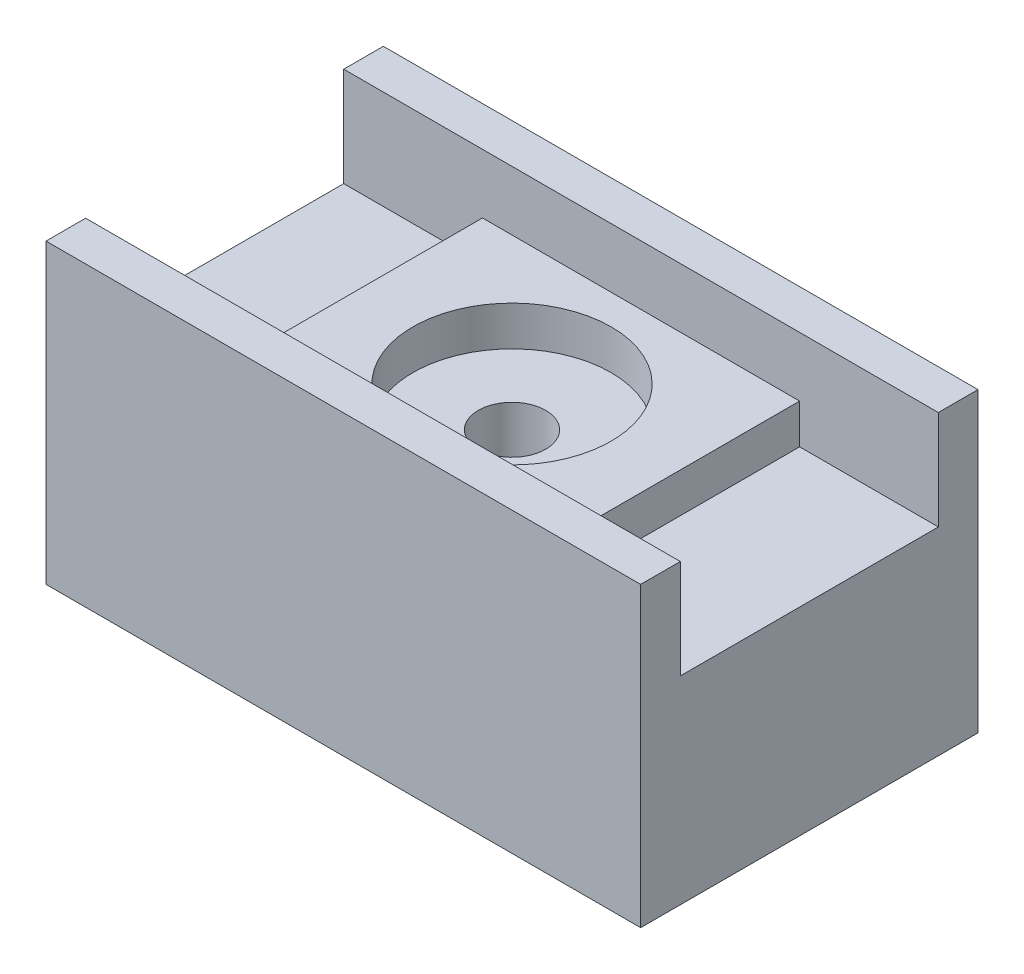
ISO-10303-21;
HEADER;
FILE_DESCRIPTION(('STEP AP214'),'2;1');
FILE_NAME('part.step','',(''),(''),'','','');
FILE_SCHEMA(('AUTOMOTIVE_DESIGN { 1 0 10303 214 1 1 1 1 }'));
ENDSEC;
DATA;
#1=APPLICATION_CONTEXT('core data for automotive mechanical design processes');
#2=APPLICATION_PROTOCOL_DEFINITION('international standard','automotive_design',2000,#1);
#3=PRODUCT_CONTEXT('',#1,'mechanical');
#4=PRODUCT('Part','Part','',(#3));
#5=PRODUCT_RELATED_PRODUCT_CATEGORY('part','',(#4));
#6=PRODUCT_DEFINITION_FORMATION('','',#4);
#7=PRODUCT_DEFINITION_CONTEXT('part definition',#1,'design');
#8=PRODUCT_DEFINITION('design','',#6,#7);
#9=PRODUCT_DEFINITION_SHAPE('','',#8);
#10=(LENGTH_UNIT() NAMED_UNIT(*) SI_UNIT(.MILLI.,.METRE.));
#11=(NAMED_UNIT(*) PLANE_ANGLE_UNIT() SI_UNIT($,.RADIAN.));
#12=(NAMED_UNIT(*) SI_UNIT($,.STERADIAN.) SOLID_ANGLE_UNIT());
#13=UNCERTAINTY_MEASURE_WITH_UNIT(LENGTH_MEASURE(1.E-05),#10,'distance_accuracy_value','');
#14=(GEOMETRIC_REPRESENTATION_CONTEXT(3) GLOBAL_UNCERTAINTY_ASSIGNED_CONTEXT((#13)) GLOBAL_UNIT_ASSIGNED_CONTEXT((#10,
#11,#12)) REPRESENTATION_CONTEXT('',''));
#15=CARTESIAN_POINT('',(0.,0.,0.));
#16=DIRECTION('',(0.,0.,1.));
#17=DIRECTION('',(1.,0.,0.));
#18=AXIS2_PLACEMENT_3D('',#15,#16,#17);
#19=CARTESIAN_POINT('',(0.,-10.,0.));
#20=DIRECTION('',(0.,1.,0.));
#21=DIRECTION('',(0.,0.,1.));
#22=AXIS2_PLACEMENT_3D('',#19,#20,#21);
#23=CYLINDRICAL_SURFACE('',#22,1.7);
#24=CARTESIAN_POINT('',(0.,-10.,0.));
#25=DIRECTION('',(0.,1.,0.));
#26=DIRECTION('',(0.,0.,1.));
#27=AXIS2_PLACEMENT_3D('',#24,#25,#26);
#28=CIRCLE('',#27,1.7);
#29=CARTESIAN_POINT('',(0.,-10.,1.7));
#30=VERTEX_POINT('',#29);
#31=EDGE_CURVE('E158',#30,#30,#28,.T.);
#32=ORIENTED_EDGE('',*,*,#31,.F.);
#33=EDGE_LOOP('',(#32));
#34=FACE_BOUND('',#33,.T.);
#35=CARTESIAN_POINT('',(0.,0.,0.));
#36=DIRECTION('',(0.,1.,0.));
#37=DIRECTION('',(0.,0.,1.));
#38=AXIS2_PLACEMENT_3D('',#35,#36,#37);
#39=CIRCLE('',#38,1.7);
#40=CARTESIAN_POINT('',(0.,0.,1.7));
#41=VERTEX_POINT('',#40);
#42=EDGE_CURVE('E231',#41,#41,#39,.F.);
#43=ORIENTED_EDGE('',*,*,#42,.F.);
#44=EDGE_LOOP('',(#43));
#45=FACE_BOUND('',#44,.T.);
#46=ADVANCED_FACE('F37',(#34,#45),#23,.F.);
#47=CARTESIAN_POINT('',(0.,0.,0.));
#48=DIRECTION('',(0.,1.,0.));
#49=DIRECTION('',(0.,0.,1.));
#50=AXIS2_PLACEMENT_3D('',#47,#48,#49);
#51=PLANE('',#50);
#52=DIRECTION('',(-1.,0.,0.));
#53=VECTOR('',#52,1.);
#54=CARTESIAN_POINT('',(0.,0.,-6.51));
#55=LINE('',#54,#53);
#56=CARTESIAN_POINT('',(-8.,0.,-6.51));
#57=VERTEX_POINT('',#56);
#58=CARTESIAN_POINT('',(-15.,0.,-6.51));
#59=VERTEX_POINT('',#58);
#60=EDGE_CURVE('E54',#57,#59,#55,.T.);
#61=ORIENTED_EDGE('',*,*,#60,.T.);
#62=DIRECTION('',(0.,0.,-1.));
#63=VECTOR('',#62,1.);
#64=CARTESIAN_POINT('',(-15.,0.,0.));
#65=LINE('',#64,#63);
#66=CARTESIAN_POINT('',(-15.,0.,6.51));
#67=VERTEX_POINT('',#66);
#68=EDGE_CURVE('E213',#67,#59,#65,.T.);
#69=ORIENTED_EDGE('',*,*,#68,.F.);
#70=DIRECTION('',(1.,0.,0.));
#71=VECTOR('',#70,1.);
#72=CARTESIAN_POINT('',(0.,0.,6.51));
#73=LINE('',#72,#71);
#74=CARTESIAN_POINT('',(-8.,0.,6.51));
#75=VERTEX_POINT('',#74);
#76=EDGE_CURVE('E168',#67,#75,#73,.T.);
#77=ORIENTED_EDGE('',*,*,#76,.T.);
#78=DIRECTION('',(0.,0.,1.));
#79=VECTOR('',#78,1.);
#80=CARTESIAN_POINT('',(-8.,0.,0.));
#81=LINE('',#80,#79);
#82=EDGE_CURVE('E182',#57,#75,#81,.T.);
#83=ORIENTED_EDGE('',*,*,#82,.F.);
#84=EDGE_LOOP('',(#61,#69,#77,#83));
#85=FACE_BOUND('',#84,.T.);
#86=ADVANCED_FACE('F259',(#85),#51,.T.);
#87=CARTESIAN_POINT('',(15.,-10.,0.));
#88=DIRECTION('',(1.,0.,0.));
#89=DIRECTION('',(0.,0.,-1.));
#90=AXIS2_PLACEMENT_3D('',#87,#88,#89);
#91=PLANE('',#90);
#92=DIRECTION('',(0.,0.,-1.));
#93=VECTOR('',#92,1.);
#94=CARTESIAN_POINT('',(15.,0.,0.));
#95=LINE('',#94,#93);
#96=CARTESIAN_POINT('',(15.,0.,6.51));
#97=VERTEX_POINT('',#96);
#98=CARTESIAN_POINT('',(15.,0.,-6.51));
#99=VERTEX_POINT('',#98);
#100=EDGE_CURVE('E62',#97,#99,#95,.T.);
#101=ORIENTED_EDGE('',*,*,#100,.F.);
#102=DIRECTION('',(0.,-1.,0.));
#103=VECTOR('',#102,1.);
#104=CARTESIAN_POINT('',(15.,5.,6.51));
#105=LINE('',#104,#103);
#106=CARTESIAN_POINT('',(15.,5.,6.51));
#107=VERTEX_POINT('',#106);
#108=EDGE_CURVE('E176',#107,#97,#105,.T.);
#109=ORIENTED_EDGE('',*,*,#108,.F.);
#110=DIRECTION('',(0.,0.,-1.));
#111=VECTOR('',#110,1.);
#112=CARTESIAN_POINT('',(15.,5.,0.));
#113=LINE('',#112,#111);
#114=CARTESIAN_POINT('',(15.,5.,8.51));
#115=VERTEX_POINT('',#114);
#116=EDGE_CURVE('E174',#115,#107,#113,.T.);
#117=ORIENTED_EDGE('',*,*,#116,.F.);
#118=DIRECTION('',(0.,1.,0.));
#119=VECTOR('',#118,1.);
#120=CARTESIAN_POINT('',(15.,-10.,8.51));
#121=LINE('',#120,#119);
#122=CARTESIAN_POINT('',(15.,-10.,8.51));
#123=VERTEX_POINT('',#122);
#124=EDGE_CURVE('E12',#123,#115,#121,.T.);
#125=ORIENTED_EDGE('',*,*,#124,.F.);
#126=DIRECTION('',(0.,0.,-1.));
#127=VECTOR('',#126,1.);
#128=CARTESIAN_POINT('',(15.,-10.,0.));
#129=LINE('',#128,#127);
#130=CARTESIAN_POINT('',(15.,-10.,-8.51));
#131=VERTEX_POINT('',#130);
#132=EDGE_CURVE('E210',#123,#131,#129,.T.);
#133=ORIENTED_EDGE('',*,*,#132,.T.);
#134=DIRECTION('',(0.,1.,0.));
#135=VECTOR('',#134,1.);
#136=CARTESIAN_POINT('',(15.,-10.,-8.51));
#137=LINE('',#136,#135);
#138=CARTESIAN_POINT('',(15.,5.,-8.51));
#139=VERTEX_POINT('',#138);
#140=EDGE_CURVE('E41',#131,#139,#137,.T.);
#141=ORIENTED_EDGE('',*,*,#140,.T.);
#142=DIRECTION('',(0.,0.,-1.));
#143=VECTOR('',#142,1.);
#144=CARTESIAN_POINT('',(15.,5.,0.));
#145=LINE('',#144,#143);
#146=CARTESIAN_POINT('',(15.,5.,-6.51));
#147=VERTEX_POINT('',#146);
#148=EDGE_CURVE('E144',#147,#139,#145,.T.);
#149=ORIENTED_EDGE('',*,*,#148,.F.);
#150=DIRECTION('',(0.,-1.,0.));
#151=VECTOR('',#150,1.);
#152=CARTESIAN_POINT('',(15.,5.,-6.51));
#153=LINE('',#152,#151);
#154=EDGE_CURVE('E129',#147,#99,#153,.T.);
#155=ORIENTED_EDGE('',*,*,#154,.T.);
#156=EDGE_LOOP('',(#101,#109,#117,#125,#133,#141,#149,#155));
#157=FACE_BOUND('',#156,.T.);
#158=ADVANCED_FACE('F39',(#157),#91,.T.);
#159=CARTESIAN_POINT('',(0.,-10.,8.51));
#160=DIRECTION('',(0.,0.,1.));
#161=DIRECTION('',(1.,0.,0.));
#162=AXIS2_PLACEMENT_3D('',#159,#160,#161);
#163=PLANE('',#162);
#164=ORIENTED_EDGE('',*,*,#124,.T.);
#165=DIRECTION('',(1.,0.,0.));
#166=VECTOR('',#165,1.);
#167=CARTESIAN_POINT('',(0.,5.,8.51));
#168=LINE('',#167,#166);
#169=CARTESIAN_POINT('',(-15.,5.,8.51));
#170=VERTEX_POINT('',#169);
#171=EDGE_CURVE('E171',#170,#115,#168,.T.);
#172=ORIENTED_EDGE('',*,*,#171,.F.);
#173=DIRECTION('',(0.,1.,0.));
#174=VECTOR('',#173,1.);
#175=CARTESIAN_POINT('',(-15.,-10.,8.51));
#176=LINE('',#175,#174);
#177=CARTESIAN_POINT('',(-15.,-10.,8.51));
#178=VERTEX_POINT('',#177);
#179=EDGE_CURVE('E46',#178,#170,#176,.T.);
#180=ORIENTED_EDGE('',*,*,#179,.F.);
#181=DIRECTION('',(1.,0.,0.));
#182=VECTOR('',#181,1.);
#183=CARTESIAN_POINT('',(0.,-10.,8.51));
#184=LINE('',#183,#182);
#185=EDGE_CURVE('E217',#178,#123,#184,.T.);
#186=ORIENTED_EDGE('',*,*,#185,.T.);
#187=EDGE_LOOP('',(#164,#172,#180,#186));
#188=FACE_BOUND('',#187,.T.);
#189=ADVANCED_FACE('F267',(#188),#163,.T.);
#190=CARTESIAN_POINT('',(-15.,-10.,0.));
#191=DIRECTION('',(1.,0.,0.));
#192=DIRECTION('',(0.,0.,-1.));
#193=AXIS2_PLACEMENT_3D('',#190,#191,#192);
#194=PLANE('',#193);
#195=ORIENTED_EDGE('',*,*,#179,.T.);
#196=DIRECTION('',(0.,0.,-1.));
#197=VECTOR('',#196,1.);
#198=CARTESIAN_POINT('',(-15.,5.,0.));
#199=LINE('',#198,#197);
#200=CARTESIAN_POINT('',(-15.,5.,6.51));
#201=VERTEX_POINT('',#200);
#202=EDGE_CURVE('E167',#170,#201,#199,.T.);
#203=ORIENTED_EDGE('',*,*,#202,.T.);
#204=DIRECTION('',(0.,-1.,0.));
#205=VECTOR('',#204,1.);
#206=CARTESIAN_POINT('',(-15.,5.,6.51));
#207=LINE('',#206,#205);
#208=EDGE_CURVE('E180',#201,#67,#207,.T.);
#209=ORIENTED_EDGE('',*,*,#208,.T.);
#210=ORIENTED_EDGE('',*,*,#68,.T.);
#211=DIRECTION('',(0.,-1.,0.));
#212=VECTOR('',#211,1.);
#213=CARTESIAN_POINT('',(-15.,5.,-6.51));
#214=LINE('',#213,#212);
#215=CARTESIAN_POINT('',(-15.,5.,-6.51));
#216=VERTEX_POINT('',#215);
#217=EDGE_CURVE('E141',#216,#59,#214,.T.);
#218=ORIENTED_EDGE('',*,*,#217,.F.);
#219=DIRECTION('',(0.,0.,-1.));
#220=VECTOR('',#219,1.);
#221=CARTESIAN_POINT('',(-15.,5.,0.));
#222=LINE('',#221,#220);
#223=CARTESIAN_POINT('',(-15.,5.,-8.51));
#224=VERTEX_POINT('',#223);
#225=EDGE_CURVE('E154',#216,#224,#222,.T.);
#226=ORIENTED_EDGE('',*,*,#225,.T.);
#227=DIRECTION('',(0.,1.,0.));
#228=VECTOR('',#227,1.);
#229=CARTESIAN_POINT('',(-15.,-10.,-8.51));
#230=LINE('',#229,#228);
#231=CARTESIAN_POINT('',(-15.,-10.,-8.51));
#232=VERTEX_POINT('',#231);
#233=EDGE_CURVE('E222',#232,#224,#230,.T.);
#234=ORIENTED_EDGE('',*,*,#233,.F.);
#235=DIRECTION('',(0.,0.,-1.));
#236=VECTOR('',#235,1.);
#237=CARTESIAN_POINT('',(-15.,-10.,0.));
#238=LINE('',#237,#236);
#239=EDGE_CURVE('E215',#178,#232,#238,.T.);
#240=ORIENTED_EDGE('',*,*,#239,.F.);
#241=EDGE_LOOP('',(#195,#203,#209,#210,#218,#226,#234,#240));
#242=FACE_BOUND('',#241,.T.);
#243=ADVANCED_FACE('F229',(#242),#194,.F.);
#244=CARTESIAN_POINT('',(0.,-10.,-8.51));
#245=DIRECTION('',(0.,0.,1.));
#246=DIRECTION('',(1.,0.,0.));
#247=AXIS2_PLACEMENT_3D('',#244,#245,#246);
#248=PLANE('',#247);
#249=ORIENTED_EDGE('',*,*,#233,.T.);
#250=DIRECTION('',(1.,0.,0.));
#251=VECTOR('',#250,1.);
#252=CARTESIAN_POINT('',(0.,5.,-8.51));
#253=LINE('',#252,#251);
#254=EDGE_CURVE('E150',#224,#139,#253,.T.);
#255=ORIENTED_EDGE('',*,*,#254,.T.);
#256=ORIENTED_EDGE('',*,*,#140,.F.);
#257=DIRECTION('',(1.,0.,0.));
#258=VECTOR('',#257,1.);
#259=CARTESIAN_POINT('',(0.,-10.,-8.51));
#260=LINE('',#259,#258);
#261=EDGE_CURVE('E212',#232,#131,#260,.T.);
#262=ORIENTED_EDGE('',*,*,#261,.F.);
#263=EDGE_LOOP('',(#249,#255,#256,#262));
#264=FACE_BOUND('',#263,.T.);
#265=ADVANCED_FACE('F226',(#264),#248,.F.);
#266=CARTESIAN_POINT('',(0.,-10.,0.));
#267=DIRECTION('',(0.,1.,0.));
#268=DIRECTION('',(0.,0.,1.));
#269=AXIS2_PLACEMENT_3D('',#266,#267,#268);
#270=PLANE('',#269);
#271=ORIENTED_EDGE('',*,*,#31,.T.);
#272=EDGE_LOOP('',(#271));
#273=FACE_BOUND('',#272,.T.);
#274=ORIENTED_EDGE('',*,*,#132,.F.);
#275=ORIENTED_EDGE('',*,*,#185,.F.);
#276=ORIENTED_EDGE('',*,*,#239,.T.);
#277=ORIENTED_EDGE('',*,*,#261,.T.);
#278=EDGE_LOOP('',(#274,#275,#276,#277));
#279=FACE_BOUND('',#278,.T.);
#280=ADVANCED_FACE('F273',(#273,#279),#270,.F.);
#281=CARTESIAN_POINT('',(8.00000000000001,0.,-6.51));
#282=VERTEX_POINT('',#281);
#283=EDGE_CURVE('E138',#99,#282,#55,.T.);
#284=ORIENTED_EDGE('',*,*,#283,.T.);
#285=DIRECTION('',(0.,0.,1.));
#286=VECTOR('',#285,1.);
#287=CARTESIAN_POINT('',(8.00000000000001,0.,0.));
#288=LINE('',#287,#286);
#289=CARTESIAN_POINT('',(8.00000000000001,0.,6.51));
#290=VERTEX_POINT('',#289);
#291=EDGE_CURVE('E187',#282,#290,#288,.T.);
#292=ORIENTED_EDGE('',*,*,#291,.T.);
#293=EDGE_CURVE('E140',#290,#97,#73,.T.);
#294=ORIENTED_EDGE('',*,*,#293,.T.);
#295=ORIENTED_EDGE('',*,*,#100,.T.);
#296=EDGE_LOOP('',(#284,#292,#294,#295));
#297=FACE_BOUND('',#296,.T.);
#298=ADVANCED_FACE('F262',(#297),#51,.T.);
#299=CARTESIAN_POINT('',(-8.,2.,0.));
#300=DIRECTION('',(1.,0.,0.));
#301=DIRECTION('',(0.,0.,-1.));
#302=AXIS2_PLACEMENT_3D('',#299,#300,#301);
#303=PLANE('',#302);
#304=ORIENTED_EDGE('',*,*,#82,.T.);
#305=DIRECTION('',(0.,-1.,0.));
#306=VECTOR('',#305,1.);
#307=CARTESIAN_POINT('',(-8.,2.,6.51));
#308=LINE('',#307,#306);
#309=CARTESIAN_POINT('',(-8.,2.,6.51));
#310=VERTEX_POINT('',#309);
#311=EDGE_CURVE('E208',#310,#75,#308,.T.);
#312=ORIENTED_EDGE('',*,*,#311,.F.);
#313=DIRECTION('',(0.,0.,1.));
#314=VECTOR('',#313,1.);
#315=CARTESIAN_POINT('',(-8.,2.,0.));
#316=LINE('',#315,#314);
#317=CARTESIAN_POINT('',(-8.,2.,-6.51));
#318=VERTEX_POINT('',#317);
#319=EDGE_CURVE('E183',#318,#310,#316,.T.);
#320=ORIENTED_EDGE('',*,*,#319,.F.);
#321=DIRECTION('',(0.,-1.,0.));
#322=VECTOR('',#321,1.);
#323=CARTESIAN_POINT('',(-8.,2.,-6.51));
#324=LINE('',#323,#322);
#325=EDGE_CURVE('E196',#318,#57,#324,.T.);
#326=ORIENTED_EDGE('',*,*,#325,.T.);
#327=EDGE_LOOP('',(#304,#312,#320,#326));
#328=FACE_BOUND('',#327,.T.);
#329=ADVANCED_FACE('F256',(#328),#303,.F.);
#330=CARTESIAN_POINT('',(8.00000000000001,2.,0.));
#331=DIRECTION('',(1.,0.,0.));
#332=DIRECTION('',(0.,0.,-1.));
#333=AXIS2_PLACEMENT_3D('',#330,#331,#332);
#334=PLANE('',#333);
#335=ORIENTED_EDGE('',*,*,#291,.F.);
#336=DIRECTION('',(0.,-1.,0.));
#337=VECTOR('',#336,1.);
#338=CARTESIAN_POINT('',(8.00000000000001,2.,-6.51));
#339=LINE('',#338,#337);
#340=CARTESIAN_POINT('',(8.00000000000001,2.,-6.51));
#341=VERTEX_POINT('',#340);
#342=EDGE_CURVE('E203',#341,#282,#339,.T.);
#343=ORIENTED_EDGE('',*,*,#342,.F.);
#344=DIRECTION('',(0.,0.,1.));
#345=VECTOR('',#344,1.);
#346=CARTESIAN_POINT('',(8.00000000000001,2.,0.));
#347=LINE('',#346,#345);
#348=CARTESIAN_POINT('',(8.00000000000001,2.,6.51));
#349=VERTEX_POINT('',#348);
#350=EDGE_CURVE('E190',#341,#349,#347,.T.);
#351=ORIENTED_EDGE('',*,*,#350,.T.);
#352=DIRECTION('',(0.,-1.,0.));
#353=VECTOR('',#352,1.);
#354=CARTESIAN_POINT('',(8.00000000000001,2.,6.51));
#355=LINE('',#354,#353);
#356=EDGE_CURVE('E205',#349,#290,#355,.T.);
#357=ORIENTED_EDGE('',*,*,#356,.T.);
#358=EDGE_LOOP('',(#335,#343,#351,#357));
#359=FACE_BOUND('',#358,.T.);
#360=ADVANCED_FACE('F251',(#359),#334,.T.);
#361=CARTESIAN_POINT('',(0.,2.,0.));
#362=DIRECTION('',(0.,1.,0.));
#363=DIRECTION('',(0.,0.,1.));
#364=AXIS2_PLACEMENT_3D('',#361,#362,#363);
#365=PLANE('',#364);
#366=CARTESIAN_POINT('',(0.,2.,0.));
#367=DIRECTION('',(0.,1.,0.));
#368=DIRECTION('',(0.,0.,1.));
#369=AXIS2_PLACEMENT_3D('',#366,#367,#368);
#370=CIRCLE('',#369,5.);
#371=CARTESIAN_POINT('',(0.,2.,5.));
#372=VERTEX_POINT('',#371);
#373=EDGE_CURVE('E239',#372,#372,#370,.T.);
#374=ORIENTED_EDGE('',*,*,#373,.F.);
#375=EDGE_LOOP('',(#374));
#376=FACE_BOUND('',#375,.T.);
#377=ORIENTED_EDGE('',*,*,#319,.T.);
#378=DIRECTION('',(1.,0.,0.));
#379=VECTOR('',#378,1.);
#380=CARTESIAN_POINT('',(0.,2.,6.51));
#381=LINE('',#380,#379);
#382=EDGE_CURVE('E186',#310,#349,#381,.T.);
#383=ORIENTED_EDGE('',*,*,#382,.T.);
#384=ORIENTED_EDGE('',*,*,#350,.F.);
#385=DIRECTION('',(1.,0.,0.));
#386=VECTOR('',#385,1.);
#387=CARTESIAN_POINT('',(0.,2.,-6.51));
#388=LINE('',#387,#386);
#389=EDGE_CURVE('E193',#318,#341,#388,.T.);
#390=ORIENTED_EDGE('',*,*,#389,.F.);
#391=EDGE_LOOP('',(#377,#383,#384,#390));
#392=FACE_BOUND('',#391,.T.);
#393=ADVANCED_FACE('F247',(#376,#392),#365,.T.);
#394=CARTESIAN_POINT('',(0.,5.,6.51));
#395=DIRECTION('',(0.,0.,-1.));
#396=DIRECTION('',(-1.,0.,0.));
#397=AXIS2_PLACEMENT_3D('',#394,#395,#396);
#398=PLANE('',#397);
#399=ORIENTED_EDGE('',*,*,#311,.T.);
#400=ORIENTED_EDGE('',*,*,#76,.F.);
#401=ORIENTED_EDGE('',*,*,#208,.F.);
#402=DIRECTION('',(1.,0.,0.));
#403=VECTOR('',#402,1.);
#404=CARTESIAN_POINT('',(0.,5.,6.51));
#405=LINE('',#404,#403);
#406=EDGE_CURVE('E164',#201,#107,#405,.T.);
#407=ORIENTED_EDGE('',*,*,#406,.T.);
#408=ORIENTED_EDGE('',*,*,#108,.T.);
#409=ORIENTED_EDGE('',*,*,#293,.F.);
#410=ORIENTED_EDGE('',*,*,#356,.F.);
#411=ORIENTED_EDGE('',*,*,#382,.F.);
#412=EDGE_LOOP('',(#399,#400,#401,#407,#408,#409,#410,#411));
#413=FACE_BOUND('',#412,.T.);
#414=ADVANCED_FACE('F250',(#413),#398,.T.);
#415=CARTESIAN_POINT('',(0.,5.,0.));
#416=DIRECTION('',(0.,1.,0.));
#417=DIRECTION('',(0.,0.,1.));
#418=AXIS2_PLACEMENT_3D('',#415,#416,#417);
#419=PLANE('',#418);
#420=ORIENTED_EDGE('',*,*,#406,.F.);
#421=ORIENTED_EDGE('',*,*,#202,.F.);
#422=ORIENTED_EDGE('',*,*,#171,.T.);
#423=ORIENTED_EDGE('',*,*,#116,.T.);
#424=EDGE_LOOP('',(#420,#421,#422,#423));
#425=FACE_BOUND('',#424,.T.);
#426=ADVANCED_FACE('F287',(#425),#419,.T.);
#427=CARTESIAN_POINT('',(0.,5.,-6.51));
#428=DIRECTION('',(0.,0.,1.));
#429=DIRECTION('',(1.,0.,0.));
#430=AXIS2_PLACEMENT_3D('',#427,#428,#429);
#431=PLANE('',#430);
#432=ORIENTED_EDGE('',*,*,#325,.F.);
#433=ORIENTED_EDGE('',*,*,#389,.T.);
#434=ORIENTED_EDGE('',*,*,#342,.T.);
#435=ORIENTED_EDGE('',*,*,#283,.F.);
#436=ORIENTED_EDGE('',*,*,#154,.F.);
#437=DIRECTION('',(-1.,0.,0.));
#438=VECTOR('',#437,1.);
#439=CARTESIAN_POINT('',(0.,5.,-6.51));
#440=LINE('',#439,#438);
#441=EDGE_CURVE('E135',#147,#216,#440,.T.);
#442=ORIENTED_EDGE('',*,*,#441,.T.);
#443=ORIENTED_EDGE('',*,*,#217,.T.);
#444=ORIENTED_EDGE('',*,*,#60,.F.);
#445=EDGE_LOOP('',(#432,#433,#434,#435,#436,#442,#443,#444));
#446=FACE_BOUND('',#445,.T.);
#447=ADVANCED_FACE('F132',(#446),#431,.T.);
#448=CARTESIAN_POINT('',(0.,5.,0.));
#449=DIRECTION('',(0.,1.,0.));
#450=DIRECTION('',(0.,0.,1.));
#451=AXIS2_PLACEMENT_3D('',#448,#449,#450);
#452=PLANE('',#451);
#453=ORIENTED_EDGE('',*,*,#441,.F.);
#454=ORIENTED_EDGE('',*,*,#148,.T.);
#455=ORIENTED_EDGE('',*,*,#254,.F.);
#456=ORIENTED_EDGE('',*,*,#225,.F.);
#457=EDGE_LOOP('',(#453,#454,#455,#456));
#458=FACE_BOUND('',#457,.T.);
#459=ADVANCED_FACE('F152',(#458),#452,.T.);
#460=CARTESIAN_POINT('',(0.,-24.142135623731,0.));
#461=DIRECTION('',(0.,1.,0.));
#462=DIRECTION('',(0.,0.,1.));
#463=AXIS2_PLACEMENT_3D('',#460,#461,#462);
#464=CYLINDRICAL_SURFACE('',#463,5.);
#465=CARTESIAN_POINT('',(0.,0.,0.));
#466=DIRECTION('',(0.,1.,0.));
#467=DIRECTION('',(0.,0.,1.));
#468=AXIS2_PLACEMENT_3D('',#465,#466,#467);
#469=CIRCLE('',#468,5.);
#470=CARTESIAN_POINT('',(0.,0.,5.));
#471=VERTEX_POINT('',#470);
#472=EDGE_CURVE('E235',#471,#471,#469,.F.);
#473=ORIENTED_EDGE('',*,*,#472,.T.);
#474=EDGE_LOOP('',(#473));
#475=FACE_BOUND('',#474,.T.);
#476=ORIENTED_EDGE('',*,*,#373,.T.);
#477=EDGE_LOOP('',(#476));
#478=FACE_BOUND('',#477,.T.);
#479=ADVANCED_FACE('F245',(#475,#478),#464,.F.);
#480=CARTESIAN_POINT('',(0.,0.,0.));
#481=DIRECTION('',(0.,1.,0.));
#482=DIRECTION('',(0.,0.,1.));
#483=AXIS2_PLACEMENT_3D('',#480,#481,#482);
#484=PLANE('',#483);
#485=ORIENTED_EDGE('',*,*,#472,.F.);
#486=EDGE_LOOP('',(#485));
#487=FACE_BOUND('',#486,.T.);
#488=ORIENTED_EDGE('',*,*,#42,.T.);
#489=EDGE_LOOP('',(#488));
#490=FACE_BOUND('',#489,.T.);
#491=ADVANCED_FACE('F339',(#487,#490),#484,.T.);
#492=CLOSED_SHELL('',(#46,#86,#158,#189,#243,#265,#280,#298,#329,#360,#393,#414,#426,#447,#459,
#479,#491));
#493=MANIFOLD_SOLID_BREP('B2',#492);
#494=ADVANCED_BREP_SHAPE_REPRESENTATION('',(#18,#493),#14);
#495=SHAPE_DEFINITION_REPRESENTATION(#9,#494);
ENDSEC;
END-ISO-10303-21;
